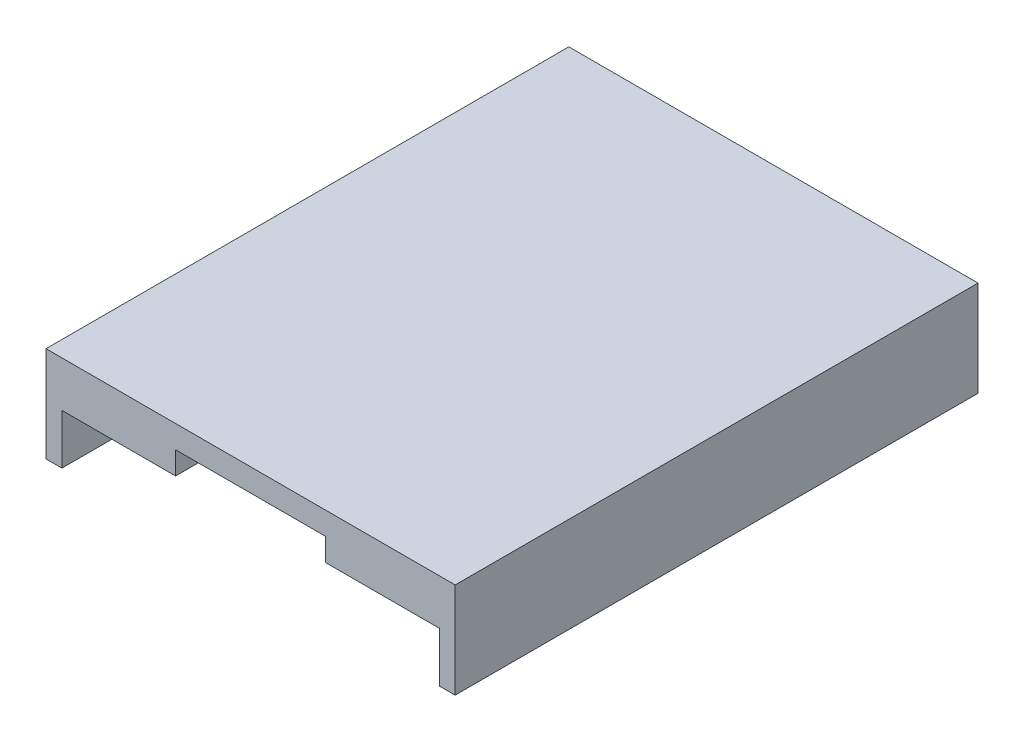
ISO-10303-21;
HEADER;
FILE_DESCRIPTION(('STEP AP214'),'2;1');
FILE_NAME('part.step','',(''),(''),'','','');
FILE_SCHEMA(('AUTOMOTIVE_DESIGN { 1 0 10303 214 1 1 1 1 }'));
ENDSEC;
DATA;
#1=APPLICATION_CONTEXT('core data for automotive mechanical design processes');
#2=APPLICATION_PROTOCOL_DEFINITION('international standard','automotive_design',2000,#1);
#3=PRODUCT_CONTEXT('',#1,'mechanical');
#4=PRODUCT('Part','Part','',(#3));
#5=PRODUCT_RELATED_PRODUCT_CATEGORY('part','',(#4));
#6=PRODUCT_DEFINITION_FORMATION('','',#4);
#7=PRODUCT_DEFINITION_CONTEXT('part definition',#1,'design');
#8=PRODUCT_DEFINITION('design','',#6,#7);
#9=PRODUCT_DEFINITION_SHAPE('','',#8);
#10=(LENGTH_UNIT() NAMED_UNIT(*) SI_UNIT(.MILLI.,.METRE.));
#11=(NAMED_UNIT(*) PLANE_ANGLE_UNIT() SI_UNIT($,.RADIAN.));
#12=(NAMED_UNIT(*) SI_UNIT($,.STERADIAN.) SOLID_ANGLE_UNIT());
#13=UNCERTAINTY_MEASURE_WITH_UNIT(LENGTH_MEASURE(1.E-05),#10,'distance_accuracy_value','');
#14=(GEOMETRIC_REPRESENTATION_CONTEXT(3) GLOBAL_UNCERTAINTY_ASSIGNED_CONTEXT((#13)) GLOBAL_UNIT_ASSIGNED_CONTEXT((#10,
#11,#12)) REPRESENTATION_CONTEXT('',''));
#15=CARTESIAN_POINT('',(0.,0.,0.));
#16=DIRECTION('',(0.,0.,1.));
#17=DIRECTION('',(1.,0.,0.));
#18=AXIS2_PLACEMENT_3D('',#15,#16,#17);
#19=CARTESIAN_POINT('',(3.5,0.,57.5));
#20=DIRECTION('',(0.,1.,0.));
#21=DIRECTION('',(0.,0.,1.));
#22=AXIS2_PLACEMENT_3D('',#19,#20,#21);
#23=PLANE('',#22);
#24=DIRECTION('',(1.,0.,0.));
#25=VECTOR('',#24,1.);
#26=CARTESIAN_POINT('',(3.5,0.,-57.5));
#27=LINE('',#26,#25);
#28=CARTESIAN_POINT('',(0.,0.,-57.5));
#29=VERTEX_POINT('',#28);
#30=CARTESIAN_POINT('',(3.5,0.,-57.5));
#31=VERTEX_POINT('',#30);
#32=EDGE_CURVE('E153',#29,#31,#27,.T.);
#33=ORIENTED_EDGE('',*,*,#32,.T.);
#34=DIRECTION('',(0.,0.,-1.));
#35=VECTOR('',#34,1.);
#36=CARTESIAN_POINT('',(3.5,0.,57.5));
#37=LINE('',#36,#35);
#38=CARTESIAN_POINT('',(3.5,0.,57.5));
#39=VERTEX_POINT('',#38);
#40=EDGE_CURVE('E11',#39,#31,#37,.T.);
#41=ORIENTED_EDGE('',*,*,#40,.F.);
#42=DIRECTION('',(1.,0.,0.));
#43=VECTOR('',#42,1.);
#44=CARTESIAN_POINT('',(3.5,0.,57.5));
#45=LINE('',#44,#43);
#46=CARTESIAN_POINT('',(0.,0.,57.5));
#47=VERTEX_POINT('',#46);
#48=EDGE_CURVE('E175',#47,#39,#45,.T.);
#49=ORIENTED_EDGE('',*,*,#48,.F.);
#50=DIRECTION('',(0.,0.,-1.));
#51=VECTOR('',#50,1.);
#52=CARTESIAN_POINT('',(0.,0.,57.5));
#53=LINE('',#52,#51);
#54=EDGE_CURVE('E149',#47,#29,#53,.T.);
#55=ORIENTED_EDGE('',*,*,#54,.T.);
#56=EDGE_LOOP('',(#33,#41,#49,#55));
#57=FACE_BOUND('',#56,.T.);
#58=ADVANCED_FACE('F33',(#57),#23,.F.);
#59=CARTESIAN_POINT('',(3.5,11.,57.5));
#60=DIRECTION('',(-1.,0.,0.));
#61=DIRECTION('',(0.,-1.,0.));
#62=AXIS2_PLACEMENT_3D('',#59,#60,#61);
#63=PLANE('',#62);
#64=DIRECTION('',(0.,1.,0.));
#65=VECTOR('',#64,1.);
#66=CARTESIAN_POINT('',(3.5,11.,-57.5));
#67=LINE('',#66,#65);
#68=CARTESIAN_POINT('',(3.5,11.,-57.5));
#69=VERTEX_POINT('',#68);
#70=EDGE_CURVE('E156',#31,#69,#67,.T.);
#71=ORIENTED_EDGE('',*,*,#70,.T.);
#72=DIRECTION('',(0.,0.,-1.));
#73=VECTOR('',#72,1.);
#74=CARTESIAN_POINT('',(3.5,11.,57.5));
#75=LINE('',#74,#73);
#76=CARTESIAN_POINT('',(3.5,11.,57.5));
#77=VERTEX_POINT('',#76);
#78=EDGE_CURVE('E41',#77,#69,#75,.T.);
#79=ORIENTED_EDGE('',*,*,#78,.F.);
#80=DIRECTION('',(0.,1.,0.));
#81=VECTOR('',#80,1.);
#82=CARTESIAN_POINT('',(3.5,11.,57.5));
#83=LINE('',#82,#81);
#84=EDGE_CURVE('E104',#39,#77,#83,.T.);
#85=ORIENTED_EDGE('',*,*,#84,.F.);
#86=ORIENTED_EDGE('',*,*,#40,.T.);
#87=EDGE_LOOP('',(#71,#79,#85,#86));
#88=FACE_BOUND('',#87,.T.);
#89=ADVANCED_FACE('F253',(#88),#63,.F.);
#90=CARTESIAN_POINT('',(28.5,11.,57.5));
#91=DIRECTION('',(0.,1.,0.));
#92=DIRECTION('',(-1.,0.,0.));
#93=AXIS2_PLACEMENT_3D('',#90,#91,#92);
#94=PLANE('',#93);
#95=DIRECTION('',(1.,0.,0.));
#96=VECTOR('',#95,1.);
#97=CARTESIAN_POINT('',(28.5,11.,-57.5));
#98=LINE('',#97,#96);
#99=CARTESIAN_POINT('',(28.5,11.,-57.5));
#100=VERTEX_POINT('',#99);
#101=EDGE_CURVE('E158',#69,#100,#98,.T.);
#102=ORIENTED_EDGE('',*,*,#101,.T.);
#103=DIRECTION('',(0.,0.,-1.));
#104=VECTOR('',#103,1.);
#105=CARTESIAN_POINT('',(28.5,11.,57.5));
#106=LINE('',#105,#104);
#107=CARTESIAN_POINT('',(28.5,11.,57.5));
#108=VERTEX_POINT('',#107);
#109=EDGE_CURVE('E194',#108,#100,#106,.T.);
#110=ORIENTED_EDGE('',*,*,#109,.F.);
#111=DIRECTION('',(1.,0.,0.));
#112=VECTOR('',#111,1.);
#113=CARTESIAN_POINT('',(28.5,11.,57.5));
#114=LINE('',#113,#112);
#115=EDGE_CURVE('E202',#77,#108,#114,.T.);
#116=ORIENTED_EDGE('',*,*,#115,.F.);
#117=ORIENTED_EDGE('',*,*,#78,.T.);
#118=EDGE_LOOP('',(#102,#110,#116,#117));
#119=FACE_BOUND('',#118,.T.);
#120=ADVANCED_FACE('F200',(#119),#94,.F.);
#121=CARTESIAN_POINT('',(28.5,16.,57.5));
#122=DIRECTION('',(-1.,0.,0.));
#123=DIRECTION('',(0.,-1.,0.));
#124=AXIS2_PLACEMENT_3D('',#121,#122,#123);
#125=PLANE('',#124);
#126=DIRECTION('',(0.,1.,0.));
#127=VECTOR('',#126,1.);
#128=CARTESIAN_POINT('',(28.5,16.,-57.5));
#129=LINE('',#128,#127);
#130=CARTESIAN_POINT('',(28.5,16.,-57.5));
#131=VERTEX_POINT('',#130);
#132=EDGE_CURVE('E160',#100,#131,#129,.T.);
#133=ORIENTED_EDGE('',*,*,#132,.T.);
#134=DIRECTION('',(0.,0.,-1.));
#135=VECTOR('',#134,1.);
#136=CARTESIAN_POINT('',(28.5,16.,57.5));
#137=LINE('',#136,#135);
#138=CARTESIAN_POINT('',(28.5,16.,57.5));
#139=VERTEX_POINT('',#138);
#140=EDGE_CURVE('E191',#139,#131,#137,.T.);
#141=ORIENTED_EDGE('',*,*,#140,.F.);
#142=DIRECTION('',(0.,1.,0.));
#143=VECTOR('',#142,1.);
#144=CARTESIAN_POINT('',(28.5,16.,57.5));
#145=LINE('',#144,#143);
#146=EDGE_CURVE('E220',#108,#139,#145,.T.);
#147=ORIENTED_EDGE('',*,*,#146,.F.);
#148=ORIENTED_EDGE('',*,*,#109,.T.);
#149=EDGE_LOOP('',(#133,#141,#147,#148));
#150=FACE_BOUND('',#149,.T.);
#151=ADVANCED_FACE('F211',(#150),#125,.F.);
#152=CARTESIAN_POINT('',(61.5,16.,57.5));
#153=DIRECTION('',(0.,1.,0.));
#154=DIRECTION('',(-1.,0.,0.));
#155=AXIS2_PLACEMENT_3D('',#152,#153,#154);
#156=PLANE('',#155);
#157=DIRECTION('',(1.,0.,0.));
#158=VECTOR('',#157,1.);
#159=CARTESIAN_POINT('',(61.5,16.,-57.5));
#160=LINE('',#159,#158);
#161=CARTESIAN_POINT('',(61.5,16.,-57.5));
#162=VERTEX_POINT('',#161);
#163=EDGE_CURVE('E162',#131,#162,#160,.T.);
#164=ORIENTED_EDGE('',*,*,#163,.T.);
#165=DIRECTION('',(0.,0.,-1.));
#166=VECTOR('',#165,1.);
#167=CARTESIAN_POINT('',(61.5,16.,57.5));
#168=LINE('',#167,#166);
#169=CARTESIAN_POINT('',(61.5,16.,57.5));
#170=VERTEX_POINT('',#169);
#171=EDGE_CURVE('E188',#170,#162,#168,.T.);
#172=ORIENTED_EDGE('',*,*,#171,.F.);
#173=DIRECTION('',(1.,0.,0.));
#174=VECTOR('',#173,1.);
#175=CARTESIAN_POINT('',(61.5,16.,57.5));
#176=LINE('',#175,#174);
#177=EDGE_CURVE('E217',#139,#170,#176,.T.);
#178=ORIENTED_EDGE('',*,*,#177,.F.);
#179=ORIENTED_EDGE('',*,*,#140,.T.);
#180=EDGE_LOOP('',(#164,#172,#178,#179));
#181=FACE_BOUND('',#180,.T.);
#182=ADVANCED_FACE('F215',(#181),#156,.F.);
#183=CARTESIAN_POINT('',(61.5,11.,57.5));
#184=DIRECTION('',(1.,0.,0.));
#185=DIRECTION('',(0.,0.,-1.));
#186=AXIS2_PLACEMENT_3D('',#183,#184,#185);
#187=PLANE('',#186);
#188=DIRECTION('',(0.,-1.,0.));
#189=VECTOR('',#188,1.);
#190=CARTESIAN_POINT('',(61.5,11.,-57.5));
#191=LINE('',#190,#189);
#192=CARTESIAN_POINT('',(61.5,11.,-57.5));
#193=VERTEX_POINT('',#192);
#194=EDGE_CURVE('E164',#162,#193,#191,.T.);
#195=ORIENTED_EDGE('',*,*,#194,.T.);
#196=DIRECTION('',(0.,0.,-1.));
#197=VECTOR('',#196,1.);
#198=CARTESIAN_POINT('',(61.5,11.,57.5));
#199=LINE('',#198,#197);
#200=CARTESIAN_POINT('',(61.5,11.,57.5));
#201=VERTEX_POINT('',#200);
#202=EDGE_CURVE('E185',#201,#193,#199,.T.);
#203=ORIENTED_EDGE('',*,*,#202,.F.);
#204=DIRECTION('',(0.,-1.,0.));
#205=VECTOR('',#204,1.);
#206=CARTESIAN_POINT('',(61.5,11.,57.5));
#207=LINE('',#206,#205);
#208=EDGE_CURVE('E219',#170,#201,#207,.T.);
#209=ORIENTED_EDGE('',*,*,#208,.F.);
#210=ORIENTED_EDGE('',*,*,#171,.T.);
#211=EDGE_LOOP('',(#195,#203,#209,#210));
#212=FACE_BOUND('',#211,.T.);
#213=ADVANCED_FACE('F266',(#212),#187,.F.);
#214=CARTESIAN_POINT('',(86.5,11.,57.5));
#215=DIRECTION('',(0.,1.,0.));
#216=DIRECTION('',(-1.,0.,0.));
#217=AXIS2_PLACEMENT_3D('',#214,#215,#216);
#218=PLANE('',#217);
#219=DIRECTION('',(1.,0.,0.));
#220=VECTOR('',#219,1.);
#221=CARTESIAN_POINT('',(86.5,11.,-57.5));
#222=LINE('',#221,#220);
#223=CARTESIAN_POINT('',(86.5,11.,-57.5));
#224=VERTEX_POINT('',#223);
#225=EDGE_CURVE('E166',#193,#224,#222,.T.);
#226=ORIENTED_EDGE('',*,*,#225,.T.);
#227=DIRECTION('',(0.,0.,-1.));
#228=VECTOR('',#227,1.);
#229=CARTESIAN_POINT('',(86.5,11.,57.5));
#230=LINE('',#229,#228);
#231=CARTESIAN_POINT('',(86.5,11.,57.5));
#232=VERTEX_POINT('',#231);
#233=EDGE_CURVE('E182',#232,#224,#230,.T.);
#234=ORIENTED_EDGE('',*,*,#233,.F.);
#235=DIRECTION('',(1.,0.,0.));
#236=VECTOR('',#235,1.);
#237=CARTESIAN_POINT('',(86.5,11.,57.5));
#238=LINE('',#237,#236);
#239=EDGE_CURVE('E222',#201,#232,#238,.T.);
#240=ORIENTED_EDGE('',*,*,#239,.F.);
#241=ORIENTED_EDGE('',*,*,#202,.T.);
#242=EDGE_LOOP('',(#226,#234,#240,#241));
#243=FACE_BOUND('',#242,.T.);
#244=ADVANCED_FACE('F269',(#243),#218,.F.);
#245=CARTESIAN_POINT('',(86.5,0.,57.5));
#246=DIRECTION('',(1.,0.,0.));
#247=DIRECTION('',(0.,0.,-1.));
#248=AXIS2_PLACEMENT_3D('',#245,#246,#247);
#249=PLANE('',#248);
#250=DIRECTION('',(0.,-1.,0.));
#251=VECTOR('',#250,1.);
#252=CARTESIAN_POINT('',(86.5,0.,-57.5));
#253=LINE('',#252,#251);
#254=CARTESIAN_POINT('',(86.5,0.,-57.5));
#255=VERTEX_POINT('',#254);
#256=EDGE_CURVE('E168',#224,#255,#253,.T.);
#257=ORIENTED_EDGE('',*,*,#256,.T.);
#258=DIRECTION('',(0.,0.,-1.));
#259=VECTOR('',#258,1.);
#260=CARTESIAN_POINT('',(86.5,0.,57.5));
#261=LINE('',#260,#259);
#262=CARTESIAN_POINT('',(86.5,0.,57.5));
#263=VERTEX_POINT('',#262);
#264=EDGE_CURVE('E179',#263,#255,#261,.T.);
#265=ORIENTED_EDGE('',*,*,#264,.F.);
#266=DIRECTION('',(0.,-1.,0.));
#267=VECTOR('',#266,1.);
#268=CARTESIAN_POINT('',(86.5,0.,57.5));
#269=LINE('',#268,#267);
#270=EDGE_CURVE('E228',#232,#263,#269,.T.);
#271=ORIENTED_EDGE('',*,*,#270,.F.);
#272=ORIENTED_EDGE('',*,*,#233,.T.);
#273=EDGE_LOOP('',(#257,#265,#271,#272));
#274=FACE_BOUND('',#273,.T.);
#275=ADVANCED_FACE('F234',(#274),#249,.F.);
#276=CARTESIAN_POINT('',(90.,0.,57.5));
#277=DIRECTION('',(0.,1.,0.));
#278=DIRECTION('',(-1.,0.,0.));
#279=AXIS2_PLACEMENT_3D('',#276,#277,#278);
#280=PLANE('',#279);
#281=DIRECTION('',(1.,0.,0.));
#282=VECTOR('',#281,1.);
#283=CARTESIAN_POINT('',(90.,0.,-57.5));
#284=LINE('',#283,#282);
#285=CARTESIAN_POINT('',(90.,0.,-57.5));
#286=VERTEX_POINT('',#285);
#287=EDGE_CURVE('E170',#255,#286,#284,.T.);
#288=ORIENTED_EDGE('',*,*,#287,.T.);
#289=DIRECTION('',(0.,0.,-1.));
#290=VECTOR('',#289,1.);
#291=CARTESIAN_POINT('',(90.,0.,57.5));
#292=LINE('',#291,#290);
#293=CARTESIAN_POINT('',(90.,0.,57.5));
#294=VERTEX_POINT('',#293);
#295=EDGE_CURVE('E144',#294,#286,#292,.T.);
#296=ORIENTED_EDGE('',*,*,#295,.F.);
#297=DIRECTION('',(1.,0.,0.));
#298=VECTOR('',#297,1.);
#299=CARTESIAN_POINT('',(90.,0.,57.5));
#300=LINE('',#299,#298);
#301=EDGE_CURVE('E135',#263,#294,#300,.T.);
#302=ORIENTED_EDGE('',*,*,#301,.F.);
#303=ORIENTED_EDGE('',*,*,#264,.T.);
#304=EDGE_LOOP('',(#288,#296,#302,#303));
#305=FACE_BOUND('',#304,.T.);
#306=ADVANCED_FACE('F238',(#305),#280,.F.);
#307=CARTESIAN_POINT('',(90.,21.,57.5));
#308=DIRECTION('',(-1.,0.,0.));
#309=DIRECTION('',(0.,0.,1.));
#310=AXIS2_PLACEMENT_3D('',#307,#308,#309);
#311=PLANE('',#310);
#312=DIRECTION('',(0.,1.,0.));
#313=VECTOR('',#312,1.);
#314=CARTESIAN_POINT('',(90.,21.,-57.5));
#315=LINE('',#314,#313);
#316=CARTESIAN_POINT('',(90.,21.,-57.5));
#317=VERTEX_POINT('',#316);
#318=EDGE_CURVE('E143',#286,#317,#315,.T.);
#319=ORIENTED_EDGE('',*,*,#318,.T.);
#320=DIRECTION('',(0.,0.,-1.));
#321=VECTOR('',#320,1.);
#322=CARTESIAN_POINT('',(90.,21.,57.5));
#323=LINE('',#322,#321);
#324=CARTESIAN_POINT('',(90.,21.,57.5));
#325=VERTEX_POINT('',#324);
#326=EDGE_CURVE('E140',#325,#317,#323,.T.);
#327=ORIENTED_EDGE('',*,*,#326,.F.);
#328=DIRECTION('',(0.,1.,0.));
#329=VECTOR('',#328,1.);
#330=CARTESIAN_POINT('',(90.,21.,57.5));
#331=LINE('',#330,#329);
#332=EDGE_CURVE('E129',#294,#325,#331,.T.);
#333=ORIENTED_EDGE('',*,*,#332,.F.);
#334=ORIENTED_EDGE('',*,*,#295,.T.);
#335=EDGE_LOOP('',(#319,#327,#333,#334));
#336=FACE_BOUND('',#335,.T.);
#337=ADVANCED_FACE('F141',(#336),#311,.F.);
#338=CARTESIAN_POINT('',(0.,21.,57.5));
#339=DIRECTION('',(0.,-1.,0.));
#340=DIRECTION('',(0.,0.,-1.));
#341=AXIS2_PLACEMENT_3D('',#338,#339,#340);
#342=PLANE('',#341);
#343=DIRECTION('',(-1.,0.,0.));
#344=VECTOR('',#343,1.);
#345=CARTESIAN_POINT('',(0.,21.,-57.5));
#346=LINE('',#345,#344);
#347=CARTESIAN_POINT('',(0.,21.,-57.5));
#348=VERTEX_POINT('',#347);
#349=EDGE_CURVE('E90',#317,#348,#346,.T.);
#350=ORIENTED_EDGE('',*,*,#349,.T.);
#351=DIRECTION('',(0.,0.,-1.));
#352=VECTOR('',#351,1.);
#353=CARTESIAN_POINT('',(0.,21.,57.5));
#354=LINE('',#353,#352);
#355=CARTESIAN_POINT('',(0.,21.,57.5));
#356=VERTEX_POINT('',#355);
#357=EDGE_CURVE('E145',#356,#348,#354,.T.);
#358=ORIENTED_EDGE('',*,*,#357,.F.);
#359=DIRECTION('',(-1.,0.,0.));
#360=VECTOR('',#359,1.);
#361=CARTESIAN_POINT('',(0.,21.,57.5));
#362=LINE('',#361,#360);
#363=EDGE_CURVE('E133',#325,#356,#362,.T.);
#364=ORIENTED_EDGE('',*,*,#363,.F.);
#365=ORIENTED_EDGE('',*,*,#326,.T.);
#366=EDGE_LOOP('',(#350,#358,#364,#365));
#367=FACE_BOUND('',#366,.T.);
#368=ADVANCED_FACE('F147',(#367),#342,.F.);
#369=CARTESIAN_POINT('',(0.,0.,57.5));
#370=DIRECTION('',(1.,0.,0.));
#371=DIRECTION('',(0.,0.,-1.));
#372=AXIS2_PLACEMENT_3D('',#369,#370,#371);
#373=PLANE('',#372);
#374=DIRECTION('',(0.,-1.,0.));
#375=VECTOR('',#374,1.);
#376=CARTESIAN_POINT('',(0.,0.,-57.5));
#377=LINE('',#376,#375);
#378=EDGE_CURVE('E96',#348,#29,#377,.T.);
#379=ORIENTED_EDGE('',*,*,#378,.T.);
#380=ORIENTED_EDGE('',*,*,#54,.F.);
#381=DIRECTION('',(0.,-1.,0.));
#382=VECTOR('',#381,1.);
#383=CARTESIAN_POINT('',(0.,0.,57.5));
#384=LINE('',#383,#382);
#385=EDGE_CURVE('E49',#356,#47,#384,.T.);
#386=ORIENTED_EDGE('',*,*,#385,.F.);
#387=ORIENTED_EDGE('',*,*,#357,.T.);
#388=EDGE_LOOP('',(#379,#380,#386,#387));
#389=FACE_BOUND('',#388,.T.);
#390=ADVANCED_FACE('F242',(#389),#373,.F.);
#391=CARTESIAN_POINT('',(0.,0.,57.5));
#392=DIRECTION('',(0.,0.,-1.));
#393=DIRECTION('',(-1.,0.,0.));
#394=AXIS2_PLACEMENT_3D('',#391,#392,#393);
#395=PLANE('',#394);
#396=ORIENTED_EDGE('',*,*,#48,.T.);
#397=ORIENTED_EDGE('',*,*,#84,.T.);
#398=ORIENTED_EDGE('',*,*,#115,.T.);
#399=ORIENTED_EDGE('',*,*,#146,.T.);
#400=ORIENTED_EDGE('',*,*,#177,.T.);
#401=ORIENTED_EDGE('',*,*,#208,.T.);
#402=ORIENTED_EDGE('',*,*,#239,.T.);
#403=ORIENTED_EDGE('',*,*,#270,.T.);
#404=ORIENTED_EDGE('',*,*,#301,.T.);
#405=ORIENTED_EDGE('',*,*,#332,.T.);
#406=ORIENTED_EDGE('',*,*,#363,.T.);
#407=ORIENTED_EDGE('',*,*,#385,.T.);
#408=EDGE_LOOP('',(#396,#397,#398,#399,#400,#401,#402,#403,#404,#405,#406,#407));
#409=FACE_BOUND('',#408,.T.);
#410=ADVANCED_FACE('F131',(#409),#395,.F.);
#411=CARTESIAN_POINT('',(0.,0.,-57.5));
#412=DIRECTION('',(0.,0.,-1.));
#413=DIRECTION('',(-1.,0.,0.));
#414=AXIS2_PLACEMENT_3D('',#411,#412,#413);
#415=PLANE('',#414);
#416=ORIENTED_EDGE('',*,*,#32,.F.);
#417=ORIENTED_EDGE('',*,*,#378,.F.);
#418=ORIENTED_EDGE('',*,*,#349,.F.);
#419=ORIENTED_EDGE('',*,*,#318,.F.);
#420=ORIENTED_EDGE('',*,*,#287,.F.);
#421=ORIENTED_EDGE('',*,*,#256,.F.);
#422=ORIENTED_EDGE('',*,*,#225,.F.);
#423=ORIENTED_EDGE('',*,*,#194,.F.);
#424=ORIENTED_EDGE('',*,*,#163,.F.);
#425=ORIENTED_EDGE('',*,*,#132,.F.);
#426=ORIENTED_EDGE('',*,*,#101,.F.);
#427=ORIENTED_EDGE('',*,*,#70,.F.);
#428=EDGE_LOOP('',(#416,#417,#418,#419,#420,#421,#422,#423,#424,#425,#426,#427));
#429=FACE_BOUND('',#428,.T.);
#430=ADVANCED_FACE('F206',(#429),#415,.T.);
#431=CLOSED_SHELL('',(#58,#89,#120,#151,#182,#213,#244,#275,#306,#337,#368,#390,#410,#430));
#432=MANIFOLD_SOLID_BREP('B2',#431);
#433=ADVANCED_BREP_SHAPE_REPRESENTATION('',(#18,#432),#14);
#434=SHAPE_DEFINITION_REPRESENTATION(#9,#433);
ENDSEC;
END-ISO-10303-21;
